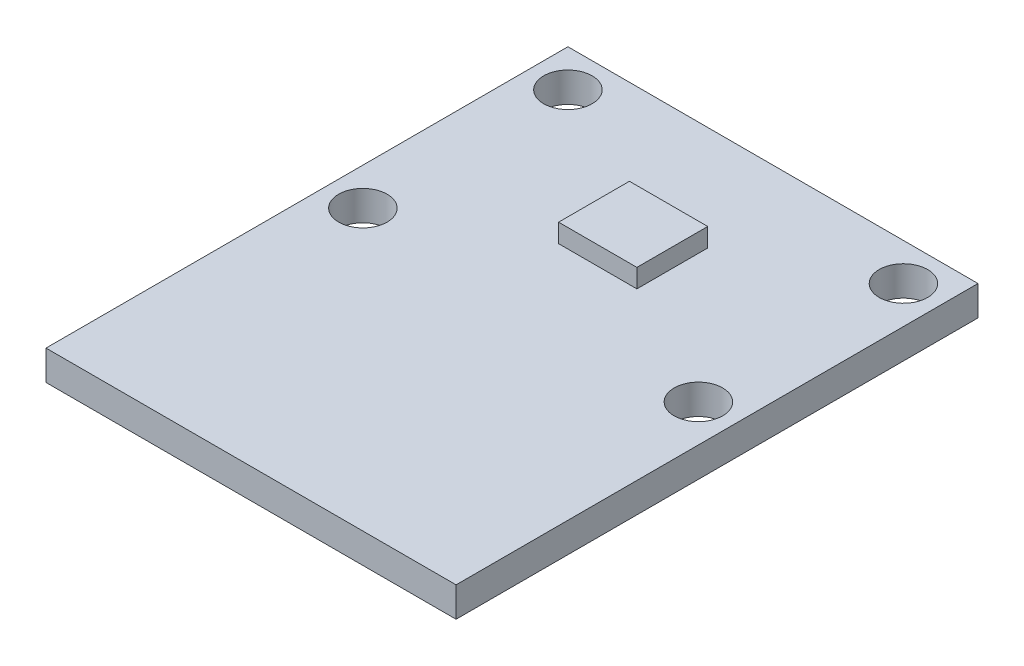
ISO-10303-21;
HEADER;
FILE_DESCRIPTION(('STEP AP214'),'2;1');
FILE_NAME('part.step','',(''),(''),'','','');
FILE_SCHEMA(('AUTOMOTIVE_DESIGN { 1 0 10303 214 1 1 1 1 }'));
ENDSEC;
DATA;
#1=APPLICATION_CONTEXT('core data for automotive mechanical design processes');
#2=APPLICATION_PROTOCOL_DEFINITION('international standard','automotive_design',2000,#1);
#3=PRODUCT_CONTEXT('',#1,'mechanical');
#4=PRODUCT('Part','Part','',(#3));
#5=PRODUCT_RELATED_PRODUCT_CATEGORY('part','',(#4));
#6=PRODUCT_DEFINITION_FORMATION('','',#4);
#7=PRODUCT_DEFINITION_CONTEXT('part definition',#1,'design');
#8=PRODUCT_DEFINITION('design','',#6,#7);
#9=PRODUCT_DEFINITION_SHAPE('','',#8);
#10=(LENGTH_UNIT() NAMED_UNIT(*) SI_UNIT(.MILLI.,.METRE.));
#11=(NAMED_UNIT(*) PLANE_ANGLE_UNIT() SI_UNIT($,.RADIAN.));
#12=(NAMED_UNIT(*) SI_UNIT($,.STERADIAN.) SOLID_ANGLE_UNIT());
#13=UNCERTAINTY_MEASURE_WITH_UNIT(LENGTH_MEASURE(1.E-05),#10,'distance_accuracy_value','');
#14=(GEOMETRIC_REPRESENTATION_CONTEXT(3) GLOBAL_UNCERTAINTY_ASSIGNED_CONTEXT((#13)) GLOBAL_UNIT_ASSIGNED_CONTEXT((#10,
#11,#12)) REPRESENTATION_CONTEXT('',''));
#15=CARTESIAN_POINT('',(0.,0.,0.));
#16=DIRECTION('',(0.,0.,1.));
#17=DIRECTION('',(1.,0.,0.));
#18=AXIS2_PLACEMENT_3D('',#15,#16,#17);
#19=CARTESIAN_POINT('',(0.,1.6,0.));
#20=DIRECTION('',(0.,1.,0.));
#21=DIRECTION('',(0.,0.,1.));
#22=AXIS2_PLACEMENT_3D('',#19,#20,#21);
#23=PLANE('',#22);
#24=CARTESIAN_POINT('',(9.,1.6,-5.5));
#25=DIRECTION('',(0.,1.,0.));
#26=DIRECTION('',(0.,0.,1.));
#27=AXIS2_PLACEMENT_3D('',#24,#25,#26);
#28=CIRCLE('',#27,1.3);
#29=CARTESIAN_POINT('',(9.,1.6,-4.2));
#30=VERTEX_POINT('',#29);
#31=EDGE_CURVE('E157',#30,#30,#28,.T.);
#32=ORIENTED_EDGE('',*,*,#31,.F.);
#33=EDGE_LOOP('',(#32));
#34=FACE_BOUND('',#33,.T.);
#35=CARTESIAN_POINT('',(-9.,1.6,-5.5));
#36=DIRECTION('',(0.,1.,0.));
#37=DIRECTION('',(0.,0.,1.));
#38=AXIS2_PLACEMENT_3D('',#35,#36,#37);
#39=CIRCLE('',#38,1.3);
#40=CARTESIAN_POINT('',(-9.,1.6,-4.2));
#41=VERTEX_POINT('',#40);
#42=EDGE_CURVE('E169',#41,#41,#39,.T.);
#43=ORIENTED_EDGE('',*,*,#42,.F.);
#44=EDGE_LOOP('',(#43));
#45=FACE_BOUND('',#44,.T.);
#46=DIRECTION('',(0.,0.,1.));
#47=VECTOR('',#46,1.);
#48=CARTESIAN_POINT('',(-11.,1.6,-7.5));
#49=LINE('',#48,#47);
#50=CARTESIAN_POINT('',(-11.,1.6,-7.5));
#51=VERTEX_POINT('',#50);
#52=CARTESIAN_POINT('',(-11.,1.6,20.5));
#53=VERTEX_POINT('',#52);
#54=EDGE_CURVE('E175',#51,#53,#49,.T.);
#55=ORIENTED_EDGE('',*,*,#54,.T.);
#56=DIRECTION('',(1.,0.,0.));
#57=VECTOR('',#56,1.);
#58=CARTESIAN_POINT('',(-11.,1.6,20.5));
#59=LINE('',#58,#57);
#60=CARTESIAN_POINT('',(11.,1.6,20.5));
#61=VERTEX_POINT('',#60);
#62=EDGE_CURVE('E99',#53,#61,#59,.T.);
#63=ORIENTED_EDGE('',*,*,#62,.T.);
#64=DIRECTION('',(0.,0.,-1.));
#65=VECTOR('',#64,1.);
#66=CARTESIAN_POINT('',(11.,1.6,-7.5));
#67=LINE('',#66,#65);
#68=CARTESIAN_POINT('',(11.,1.6,-7.5));
#69=VERTEX_POINT('',#68);
#70=EDGE_CURVE('E178',#61,#69,#67,.T.);
#71=ORIENTED_EDGE('',*,*,#70,.T.);
#72=DIRECTION('',(-1.,0.,0.));
#73=VECTOR('',#72,1.);
#74=CARTESIAN_POINT('',(-11.,1.6,-7.5));
#75=LINE('',#74,#73);
#76=EDGE_CURVE('E71',#69,#51,#75,.T.);
#77=ORIENTED_EDGE('',*,*,#76,.T.);
#78=EDGE_LOOP('',(#55,#63,#71,#77));
#79=FACE_BOUND('',#78,.T.);
#80=CARTESIAN_POINT('',(-9.,1.6,5.5));
#81=DIRECTION('',(0.,1.,0.));
#82=DIRECTION('',(0.,0.,1.));
#83=AXIS2_PLACEMENT_3D('',#80,#81,#82);
#84=CIRCLE('',#83,1.3);
#85=CARTESIAN_POINT('',(-9.,1.6,6.8));
#86=VERTEX_POINT('',#85);
#87=EDGE_CURVE('E163',#86,#86,#84,.T.);
#88=ORIENTED_EDGE('',*,*,#87,.F.);
#89=EDGE_LOOP('',(#88));
#90=FACE_BOUND('',#89,.T.);
#91=CARTESIAN_POINT('',(9.,1.6,5.5));
#92=DIRECTION('',(0.,1.,0.));
#93=DIRECTION('',(0.,0.,1.));
#94=AXIS2_PLACEMENT_3D('',#91,#92,#93);
#95=CIRCLE('',#94,1.3);
#96=CARTESIAN_POINT('',(9.,1.6,6.8));
#97=VERTEX_POINT('',#96);
#98=EDGE_CURVE('E149',#97,#97,#95,.T.);
#99=ORIENTED_EDGE('',*,*,#98,.F.);
#100=EDGE_LOOP('',(#99));
#101=FACE_BOUND('',#100,.T.);
#102=DIRECTION('',(1.,0.,0.));
#103=VECTOR('',#102,1.);
#104=CARTESIAN_POINT('',(2.1,1.6,1.9));
#105=LINE('',#104,#103);
#106=CARTESIAN_POINT('',(-2.1,1.6,1.9));
#107=VERTEX_POINT('',#106);
#108=CARTESIAN_POINT('',(2.1,1.6,1.9));
#109=VERTEX_POINT('',#108);
#110=EDGE_CURVE('E365',#107,#109,#105,.T.);
#111=ORIENTED_EDGE('',*,*,#110,.F.);
#112=DIRECTION('',(0.,0.,1.));
#113=VECTOR('',#112,1.);
#114=CARTESIAN_POINT('',(-2.1,1.6,1.9));
#115=LINE('',#114,#113);
#116=CARTESIAN_POINT('',(-2.1,1.6,-1.9));
#117=VERTEX_POINT('',#116);
#118=EDGE_CURVE('E144',#117,#107,#115,.T.);
#119=ORIENTED_EDGE('',*,*,#118,.F.);
#120=DIRECTION('',(-1.,0.,0.));
#121=VECTOR('',#120,1.);
#122=CARTESIAN_POINT('',(2.1,1.6,-1.9));
#123=LINE('',#122,#121);
#124=CARTESIAN_POINT('',(2.1,1.6,-1.9));
#125=VERTEX_POINT('',#124);
#126=EDGE_CURVE('E140',#125,#117,#123,.T.);
#127=ORIENTED_EDGE('',*,*,#126,.F.);
#128=DIRECTION('',(0.,0.,-1.));
#129=VECTOR('',#128,1.);
#130=CARTESIAN_POINT('',(2.1,1.6,1.9));
#131=LINE('',#130,#129);
#132=EDGE_CURVE('E362',#109,#125,#131,.T.);
#133=ORIENTED_EDGE('',*,*,#132,.F.);
#134=EDGE_LOOP('',(#111,#119,#127,#133));
#135=FACE_BOUND('',#134,.T.);
#136=ADVANCED_FACE('F47',(#34,#45,#79,#90,#101,#135),#23,.T.);
#137=CARTESIAN_POINT('',(0.,0.,0.));
#138=DIRECTION('',(0.,1.,0.));
#139=DIRECTION('',(0.,0.,1.));
#140=AXIS2_PLACEMENT_3D('',#137,#138,#139);
#141=PLANE('',#140);
#142=DIRECTION('',(0.,0.,1.));
#143=VECTOR('',#142,1.);
#144=CARTESIAN_POINT('',(-11.,0.,-7.5));
#145=LINE('',#144,#143);
#146=CARTESIAN_POINT('',(-11.,0.,-7.5));
#147=VERTEX_POINT('',#146);
#148=CARTESIAN_POINT('',(-11.,0.,20.5));
#149=VERTEX_POINT('',#148);
#150=EDGE_CURVE('E172',#147,#149,#145,.T.);
#151=ORIENTED_EDGE('',*,*,#150,.F.);
#152=DIRECTION('',(-1.,0.,0.));
#153=VECTOR('',#152,1.);
#154=CARTESIAN_POINT('',(-11.,0.,-7.5));
#155=LINE('',#154,#153);
#156=CARTESIAN_POINT('',(11.,0.,-7.5));
#157=VERTEX_POINT('',#156);
#158=EDGE_CURVE('E92',#157,#147,#155,.T.);
#159=ORIENTED_EDGE('',*,*,#158,.F.);
#160=DIRECTION('',(0.,0.,-1.));
#161=VECTOR('',#160,1.);
#162=CARTESIAN_POINT('',(11.,0.,-7.5));
#163=LINE('',#162,#161);
#164=CARTESIAN_POINT('',(11.,0.,20.5));
#165=VERTEX_POINT('',#164);
#166=EDGE_CURVE('E186',#165,#157,#163,.T.);
#167=ORIENTED_EDGE('',*,*,#166,.F.);
#168=DIRECTION('',(1.,0.,0.));
#169=VECTOR('',#168,1.);
#170=CARTESIAN_POINT('',(-11.,0.,20.5));
#171=LINE('',#170,#169);
#172=EDGE_CURVE('E184',#149,#165,#171,.T.);
#173=ORIENTED_EDGE('',*,*,#172,.F.);
#174=EDGE_LOOP('',(#151,#159,#167,#173));
#175=FACE_BOUND('',#174,.T.);
#176=CARTESIAN_POINT('',(-9.,0.,-5.5));
#177=DIRECTION('',(0.,1.,0.));
#178=DIRECTION('',(0.,0.,1.));
#179=AXIS2_PLACEMENT_3D('',#176,#177,#178);
#180=CIRCLE('',#179,1.3);
#181=CARTESIAN_POINT('',(-9.,0.,-4.2));
#182=VERTEX_POINT('',#181);
#183=EDGE_CURVE('E166',#182,#182,#180,.T.);
#184=ORIENTED_EDGE('',*,*,#183,.T.);
#185=EDGE_LOOP('',(#184));
#186=FACE_BOUND('',#185,.T.);
#187=CARTESIAN_POINT('',(-9.,0.,5.5));
#188=DIRECTION('',(0.,1.,0.));
#189=DIRECTION('',(0.,0.,1.));
#190=AXIS2_PLACEMENT_3D('',#187,#188,#189);
#191=CIRCLE('',#190,1.3);
#192=CARTESIAN_POINT('',(-9.,0.,6.8));
#193=VERTEX_POINT('',#192);
#194=EDGE_CURVE('E160',#193,#193,#191,.T.);
#195=ORIENTED_EDGE('',*,*,#194,.T.);
#196=EDGE_LOOP('',(#195));
#197=FACE_BOUND('',#196,.T.);
#198=CARTESIAN_POINT('',(9.,0.,-5.5));
#199=DIRECTION('',(0.,1.,0.));
#200=DIRECTION('',(0.,0.,1.));
#201=AXIS2_PLACEMENT_3D('',#198,#199,#200);
#202=CIRCLE('',#201,1.3);
#203=CARTESIAN_POINT('',(9.,0.,-4.2));
#204=VERTEX_POINT('',#203);
#205=EDGE_CURVE('E155',#204,#204,#202,.T.);
#206=ORIENTED_EDGE('',*,*,#205,.T.);
#207=EDGE_LOOP('',(#206));
#208=FACE_BOUND('',#207,.T.);
#209=CARTESIAN_POINT('',(9.,0.,5.5));
#210=DIRECTION('',(0.,1.,0.));
#211=DIRECTION('',(0.,0.,1.));
#212=AXIS2_PLACEMENT_3D('',#209,#210,#211);
#213=CIRCLE('',#212,1.3);
#214=CARTESIAN_POINT('',(9.,0.,6.8));
#215=VERTEX_POINT('',#214);
#216=EDGE_CURVE('E146',#215,#215,#213,.T.);
#217=ORIENTED_EDGE('',*,*,#216,.T.);
#218=EDGE_LOOP('',(#217));
#219=FACE_BOUND('',#218,.T.);
#220=ADVANCED_FACE('F199',(#175,#186,#197,#208,#219),#141,.F.);
#221=CARTESIAN_POINT('',(-11.,1.6,-7.5));
#222=DIRECTION('',(1.,0.,0.));
#223=DIRECTION('',(0.,0.,-1.));
#224=AXIS2_PLACEMENT_3D('',#221,#222,#223);
#225=PLANE('',#224);
#226=ORIENTED_EDGE('',*,*,#150,.T.);
#227=DIRECTION('',(0.,-1.,0.));
#228=VECTOR('',#227,1.);
#229=CARTESIAN_POINT('',(-11.,1.6,20.5));
#230=LINE('',#229,#228);
#231=EDGE_CURVE('E11',#53,#149,#230,.T.);
#232=ORIENTED_EDGE('',*,*,#231,.F.);
#233=ORIENTED_EDGE('',*,*,#54,.F.);
#234=DIRECTION('',(0.,-1.,0.));
#235=VECTOR('',#234,1.);
#236=CARTESIAN_POINT('',(-11.,1.6,-7.5));
#237=LINE('',#236,#235);
#238=EDGE_CURVE('E181',#51,#147,#237,.T.);
#239=ORIENTED_EDGE('',*,*,#238,.T.);
#240=EDGE_LOOP('',(#226,#232,#233,#239));
#241=FACE_BOUND('',#240,.T.);
#242=ADVANCED_FACE('F49',(#241),#225,.F.);
#243=CARTESIAN_POINT('',(-11.,1.6,20.5));
#244=DIRECTION('',(0.,0.,-1.));
#245=DIRECTION('',(-1.,0.,0.));
#246=AXIS2_PLACEMENT_3D('',#243,#244,#245);
#247=PLANE('',#246);
#248=ORIENTED_EDGE('',*,*,#172,.T.);
#249=DIRECTION('',(0.,-1.,0.));
#250=VECTOR('',#249,1.);
#251=CARTESIAN_POINT('',(11.,1.6,20.5));
#252=LINE('',#251,#250);
#253=EDGE_CURVE('E55',#61,#165,#252,.T.);
#254=ORIENTED_EDGE('',*,*,#253,.F.);
#255=ORIENTED_EDGE('',*,*,#62,.F.);
#256=ORIENTED_EDGE('',*,*,#231,.T.);
#257=EDGE_LOOP('',(#248,#254,#255,#256));
#258=FACE_BOUND('',#257,.T.);
#259=ADVANCED_FACE('F215',(#258),#247,.F.);
#260=CARTESIAN_POINT('',(11.,1.6,-7.5));
#261=DIRECTION('',(-1.,0.,0.));
#262=DIRECTION('',(0.,0.,1.));
#263=AXIS2_PLACEMENT_3D('',#260,#261,#262);
#264=PLANE('',#263);
#265=ORIENTED_EDGE('',*,*,#166,.T.);
#266=DIRECTION('',(0.,-1.,0.));
#267=VECTOR('',#266,1.);
#268=CARTESIAN_POINT('',(11.,1.6,-7.5));
#269=LINE('',#268,#267);
#270=EDGE_CURVE('E190',#69,#157,#269,.T.);
#271=ORIENTED_EDGE('',*,*,#270,.F.);
#272=ORIENTED_EDGE('',*,*,#70,.F.);
#273=ORIENTED_EDGE('',*,*,#253,.T.);
#274=EDGE_LOOP('',(#265,#271,#272,#273));
#275=FACE_BOUND('',#274,.T.);
#276=ADVANCED_FACE('F195',(#275),#264,.F.);
#277=CARTESIAN_POINT('',(-11.,1.6,-7.5));
#278=DIRECTION('',(0.,0.,1.));
#279=DIRECTION('',(1.,0.,0.));
#280=AXIS2_PLACEMENT_3D('',#277,#278,#279);
#281=PLANE('',#280);
#282=ORIENTED_EDGE('',*,*,#158,.T.);
#283=ORIENTED_EDGE('',*,*,#238,.F.);
#284=ORIENTED_EDGE('',*,*,#76,.F.);
#285=ORIENTED_EDGE('',*,*,#270,.T.);
#286=EDGE_LOOP('',(#282,#283,#284,#285));
#287=FACE_BOUND('',#286,.T.);
#288=ADVANCED_FACE('F204',(#287),#281,.F.);
#289=CARTESIAN_POINT('',(-9.,1.6,-5.5));
#290=DIRECTION('',(0.,-1.,0.));
#291=DIRECTION('',(0.,0.,-1.));
#292=AXIS2_PLACEMENT_3D('',#289,#290,#291);
#293=CYLINDRICAL_SURFACE('',#292,1.3);
#294=ORIENTED_EDGE('',*,*,#42,.T.);
#295=EDGE_LOOP('',(#294));
#296=FACE_BOUND('',#295,.T.);
#297=ORIENTED_EDGE('',*,*,#183,.F.);
#298=EDGE_LOOP('',(#297));
#299=FACE_BOUND('',#298,.T.);
#300=ADVANCED_FACE('F206',(#296,#299),#293,.F.);
#301=CARTESIAN_POINT('',(-9.,1.6,5.5));
#302=DIRECTION('',(0.,-1.,0.));
#303=DIRECTION('',(0.,0.,-1.));
#304=AXIS2_PLACEMENT_3D('',#301,#302,#303);
#305=CYLINDRICAL_SURFACE('',#304,1.3);
#306=ORIENTED_EDGE('',*,*,#87,.T.);
#307=EDGE_LOOP('',(#306));
#308=FACE_BOUND('',#307,.T.);
#309=ORIENTED_EDGE('',*,*,#194,.F.);
#310=EDGE_LOOP('',(#309));
#311=FACE_BOUND('',#310,.T.);
#312=ADVANCED_FACE('F212',(#308,#311),#305,.F.);
#313=CARTESIAN_POINT('',(9.,1.6,-5.5));
#314=DIRECTION('',(0.,-1.,0.));
#315=DIRECTION('',(0.,0.,-1.));
#316=AXIS2_PLACEMENT_3D('',#313,#314,#315);
#317=CYLINDRICAL_SURFACE('',#316,1.3);
#318=ORIENTED_EDGE('',*,*,#31,.T.);
#319=EDGE_LOOP('',(#318));
#320=FACE_BOUND('',#319,.T.);
#321=ORIENTED_EDGE('',*,*,#205,.F.);
#322=EDGE_LOOP('',(#321));
#323=FACE_BOUND('',#322,.T.);
#324=ADVANCED_FACE('F231',(#320,#323),#317,.F.);
#325=CARTESIAN_POINT('',(9.,1.6,5.5));
#326=DIRECTION('',(0.,-1.,0.));
#327=DIRECTION('',(0.,0.,-1.));
#328=AXIS2_PLACEMENT_3D('',#325,#326,#327);
#329=CYLINDRICAL_SURFACE('',#328,1.3);
#330=ORIENTED_EDGE('',*,*,#98,.T.);
#331=EDGE_LOOP('',(#330));
#332=FACE_BOUND('',#331,.T.);
#333=ORIENTED_EDGE('',*,*,#216,.F.);
#334=EDGE_LOOP('',(#333));
#335=FACE_BOUND('',#334,.T.);
#336=ADVANCED_FACE('F235',(#332,#335),#329,.F.);
#337=CARTESIAN_POINT('',(-2.1,2.6,1.9));
#338=DIRECTION('',(1.,0.,0.));
#339=DIRECTION('',(0.,0.,-1.));
#340=AXIS2_PLACEMENT_3D('',#337,#338,#339);
#341=PLANE('',#340);
#342=ORIENTED_EDGE('',*,*,#118,.T.);
#343=DIRECTION('',(0.,-1.,0.));
#344=VECTOR('',#343,1.);
#345=CARTESIAN_POINT('',(-2.1,2.6,1.9));
#346=LINE('',#345,#344);
#347=CARTESIAN_POINT('',(-2.1,2.6,1.9));
#348=VERTEX_POINT('',#347);
#349=EDGE_CURVE('E125',#348,#107,#346,.T.);
#350=ORIENTED_EDGE('',*,*,#349,.F.);
#351=DIRECTION('',(0.,0.,1.));
#352=VECTOR('',#351,1.);
#353=CARTESIAN_POINT('',(-2.1,2.6,1.9));
#354=LINE('',#353,#352);
#355=CARTESIAN_POINT('',(-2.1,2.6,-1.9));
#356=VERTEX_POINT('',#355);
#357=EDGE_CURVE('E132',#356,#348,#354,.T.);
#358=ORIENTED_EDGE('',*,*,#357,.F.);
#359=DIRECTION('',(0.,-1.,0.));
#360=VECTOR('',#359,1.);
#361=CARTESIAN_POINT('',(-2.1,2.6,-1.9));
#362=LINE('',#361,#360);
#363=EDGE_CURVE('E359',#356,#117,#362,.T.);
#364=ORIENTED_EDGE('',*,*,#363,.T.);
#365=EDGE_LOOP('',(#342,#350,#358,#364));
#366=FACE_BOUND('',#365,.T.);
#367=ADVANCED_FACE('F142',(#366),#341,.F.);
#368=CARTESIAN_POINT('',(2.1,2.6,1.9));
#369=DIRECTION('',(0.,0.,-1.));
#370=DIRECTION('',(-1.,0.,0.));
#371=AXIS2_PLACEMENT_3D('',#368,#369,#370);
#372=PLANE('',#371);
#373=ORIENTED_EDGE('',*,*,#110,.T.);
#374=DIRECTION('',(0.,-1.,0.));
#375=VECTOR('',#374,1.);
#376=CARTESIAN_POINT('',(2.1,2.6,1.9));
#377=LINE('',#376,#375);
#378=CARTESIAN_POINT('',(2.1,2.6,1.9));
#379=VERTEX_POINT('',#378);
#380=EDGE_CURVE('E128',#379,#109,#377,.T.);
#381=ORIENTED_EDGE('',*,*,#380,.F.);
#382=DIRECTION('',(1.,0.,0.));
#383=VECTOR('',#382,1.);
#384=CARTESIAN_POINT('',(2.1,2.6,1.9));
#385=LINE('',#384,#383);
#386=EDGE_CURVE('E121',#348,#379,#385,.T.);
#387=ORIENTED_EDGE('',*,*,#386,.F.);
#388=ORIENTED_EDGE('',*,*,#349,.T.);
#389=EDGE_LOOP('',(#373,#381,#387,#388));
#390=FACE_BOUND('',#389,.T.);
#391=ADVANCED_FACE('F123',(#390),#372,.F.);
#392=CARTESIAN_POINT('',(2.1,2.6,1.9));
#393=DIRECTION('',(-1.,0.,0.));
#394=DIRECTION('',(0.,0.,1.));
#395=AXIS2_PLACEMENT_3D('',#392,#393,#394);
#396=PLANE('',#395);
#397=ORIENTED_EDGE('',*,*,#132,.T.);
#398=DIRECTION('',(0.,-1.,0.));
#399=VECTOR('',#398,1.);
#400=CARTESIAN_POINT('',(2.1,2.6,-1.9));
#401=LINE('',#400,#399);
#402=CARTESIAN_POINT('',(2.1,2.6,-1.9));
#403=VERTEX_POINT('',#402);
#404=EDGE_CURVE('E62',#403,#125,#401,.T.);
#405=ORIENTED_EDGE('',*,*,#404,.F.);
#406=DIRECTION('',(0.,0.,-1.));
#407=VECTOR('',#406,1.);
#408=CARTESIAN_POINT('',(2.1,2.6,1.9));
#409=LINE('',#408,#407);
#410=EDGE_CURVE('E131',#379,#403,#409,.T.);
#411=ORIENTED_EDGE('',*,*,#410,.F.);
#412=ORIENTED_EDGE('',*,*,#380,.T.);
#413=EDGE_LOOP('',(#397,#405,#411,#412));
#414=FACE_BOUND('',#413,.T.);
#415=ADVANCED_FACE('F243',(#414),#396,.F.);
#416=CARTESIAN_POINT('',(2.1,2.6,-1.9));
#417=DIRECTION('',(0.,0.,1.));
#418=DIRECTION('',(1.,0.,0.));
#419=AXIS2_PLACEMENT_3D('',#416,#417,#418);
#420=PLANE('',#419);
#421=ORIENTED_EDGE('',*,*,#126,.T.);
#422=ORIENTED_EDGE('',*,*,#363,.F.);
#423=DIRECTION('',(-1.,0.,0.));
#424=VECTOR('',#423,1.);
#425=CARTESIAN_POINT('',(2.1,2.6,-1.9));
#426=LINE('',#425,#424);
#427=EDGE_CURVE('E136',#403,#356,#426,.T.);
#428=ORIENTED_EDGE('',*,*,#427,.F.);
#429=ORIENTED_EDGE('',*,*,#404,.T.);
#430=EDGE_LOOP('',(#421,#422,#428,#429));
#431=FACE_BOUND('',#430,.T.);
#432=ADVANCED_FACE('F246',(#431),#420,.F.);
#433=CARTESIAN_POINT('',(0.,2.6,0.));
#434=DIRECTION('',(0.,1.,0.));
#435=DIRECTION('',(0.,0.,1.));
#436=AXIS2_PLACEMENT_3D('',#433,#434,#435);
#437=PLANE('',#436);
#438=ORIENTED_EDGE('',*,*,#357,.T.);
#439=ORIENTED_EDGE('',*,*,#386,.T.);
#440=ORIENTED_EDGE('',*,*,#410,.T.);
#441=ORIENTED_EDGE('',*,*,#427,.T.);
#442=EDGE_LOOP('',(#438,#439,#440,#441));
#443=FACE_BOUND('',#442,.T.);
#444=ADVANCED_FACE('F135',(#443),#437,.T.);
#445=CLOSED_SHELL('',(#136,#220,#242,#259,#276,#288,#300,#312,#324,#336,#367,#391,#415,#432,#444));
#446=MANIFOLD_SOLID_BREP('B2',#445);
#447=ADVANCED_BREP_SHAPE_REPRESENTATION('',(#18,#446),#14);
#448=SHAPE_DEFINITION_REPRESENTATION(#9,#447);
ENDSEC;
END-ISO-10303-21;
